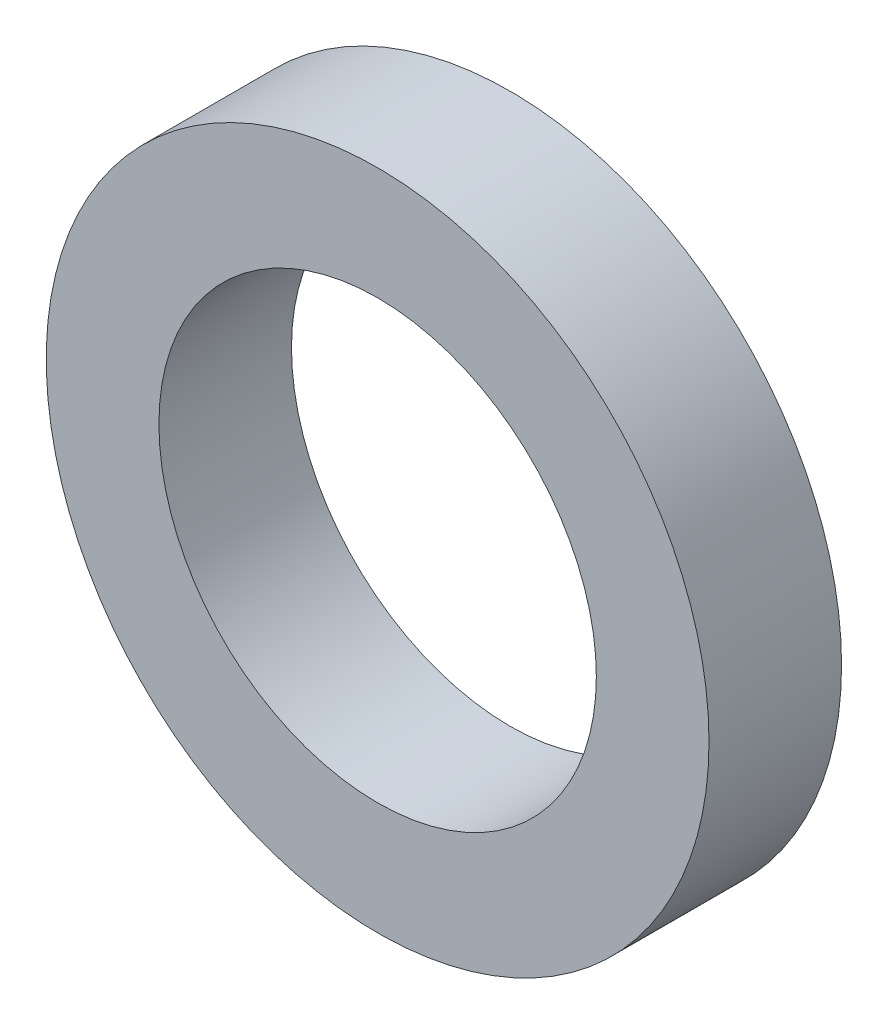
ISO-10303-21;
HEADER;
FILE_DESCRIPTION(('STEP AP214'),'2;1');
FILE_NAME('part.step','',(''),(''),'','','');
FILE_SCHEMA(('AUTOMOTIVE_DESIGN { 1 0 10303 214 1 1 1 1 }'));
ENDSEC;
DATA;
#1=APPLICATION_CONTEXT('core data for automotive mechanical design processes');
#2=APPLICATION_PROTOCOL_DEFINITION('international standard','automotive_design',2000,#1);
#3=PRODUCT_CONTEXT('',#1,'mechanical');
#4=PRODUCT('Part','Part','',(#3));
#5=PRODUCT_RELATED_PRODUCT_CATEGORY('part','',(#4));
#6=PRODUCT_DEFINITION_FORMATION('','',#4);
#7=PRODUCT_DEFINITION_CONTEXT('part definition',#1,'design');
#8=PRODUCT_DEFINITION('design','',#6,#7);
#9=PRODUCT_DEFINITION_SHAPE('','',#8);
#10=(LENGTH_UNIT() NAMED_UNIT(*) SI_UNIT(.MILLI.,.METRE.));
#11=(NAMED_UNIT(*) PLANE_ANGLE_UNIT() SI_UNIT($,.RADIAN.));
#12=(NAMED_UNIT(*) SI_UNIT($,.STERADIAN.) SOLID_ANGLE_UNIT());
#13=UNCERTAINTY_MEASURE_WITH_UNIT(LENGTH_MEASURE(1.E-05),#10,'distance_accuracy_value','');
#14=(GEOMETRIC_REPRESENTATION_CONTEXT(3) GLOBAL_UNCERTAINTY_ASSIGNED_CONTEXT((#13)) GLOBAL_UNIT_ASSIGNED_CONTEXT((#10,
#11,#12)) REPRESENTATION_CONTEXT('',''));
#15=CARTESIAN_POINT('',(0.,0.,0.));
#16=DIRECTION('',(0.,0.,1.));
#17=DIRECTION('',(1.,0.,0.));
#18=AXIS2_PLACEMENT_3D('',#15,#16,#17);
#19=CARTESIAN_POINT('',(0.,0.,2.53999999999999));
#20=DIRECTION('',(0.,0.,1.));
#21=DIRECTION('',(1.,0.,0.));
#22=AXIS2_PLACEMENT_3D('',#19,#20,#21);
#23=PLANE('',#22);
#24=CARTESIAN_POINT('',(0.,0.,2.53999999999999));
#25=DIRECTION('',(0.,0.,1.));
#26=DIRECTION('',(1.,0.,0.));
#27=AXIS2_PLACEMENT_3D('',#24,#25,#26);
#28=CIRCLE('',#27,6.35);
#29=CARTESIAN_POINT('',(6.35,0.,2.53999999999999));
#30=VERTEX_POINT('',#29);
#31=EDGE_CURVE('E12',#30,#30,#28,.T.);
#32=ORIENTED_EDGE('',*,*,#31,.T.);
#33=EDGE_LOOP('',(#32));
#34=FACE_BOUND('',#33,.T.);
#35=CARTESIAN_POINT('',(0.,0.,2.53999999999999));
#36=DIRECTION('',(0.,0.,1.));
#37=DIRECTION('',(1.,0.,0.));
#38=AXIS2_PLACEMENT_3D('',#35,#36,#37);
#39=CIRCLE('',#38,4.191);
#40=CARTESIAN_POINT('',(4.191,0.,2.53999999999999));
#41=VERTEX_POINT('',#40);
#42=EDGE_CURVE('E51',#41,#41,#39,.T.);
#43=ORIENTED_EDGE('',*,*,#42,.F.);
#44=EDGE_LOOP('',(#43));
#45=FACE_BOUND('',#44,.T.);
#46=ADVANCED_FACE('F40',(#34,#45),#23,.T.);
#47=CARTESIAN_POINT('',(0.,0.,0.));
#48=DIRECTION('',(0.,0.,1.));
#49=DIRECTION('',(1.,0.,0.));
#50=AXIS2_PLACEMENT_3D('',#47,#48,#49);
#51=PLANE('',#50);
#52=CARTESIAN_POINT('',(0.,0.,0.));
#53=DIRECTION('',(0.,0.,1.));
#54=DIRECTION('',(1.,0.,0.));
#55=AXIS2_PLACEMENT_3D('',#52,#53,#54);
#56=CIRCLE('',#55,6.35);
#57=CARTESIAN_POINT('',(6.35,0.,0.));
#58=VERTEX_POINT('',#57);
#59=EDGE_CURVE('E44',#58,#58,#56,.T.);
#60=ORIENTED_EDGE('',*,*,#59,.F.);
#61=EDGE_LOOP('',(#60));
#62=FACE_BOUND('',#61,.T.);
#63=CARTESIAN_POINT('',(0.,0.,0.));
#64=DIRECTION('',(0.,0.,1.));
#65=DIRECTION('',(1.,0.,0.));
#66=AXIS2_PLACEMENT_3D('',#63,#64,#65);
#67=CIRCLE('',#66,4.191);
#68=CARTESIAN_POINT('',(4.191,0.,0.));
#69=VERTEX_POINT('',#68);
#70=EDGE_CURVE('E53',#69,#69,#67,.T.);
#71=ORIENTED_EDGE('',*,*,#70,.T.);
#72=EDGE_LOOP('',(#71));
#73=FACE_BOUND('',#72,.T.);
#74=ADVANCED_FACE('F63',(#62,#73),#51,.F.);
#75=CARTESIAN_POINT('',(0.,0.,2.53999999999999));
#76=DIRECTION('',(0.,0.,-1.));
#77=DIRECTION('',(-1.,0.,0.));
#78=AXIS2_PLACEMENT_3D('',#75,#76,#77);
#79=CYLINDRICAL_SURFACE('',#78,6.35);
#80=ORIENTED_EDGE('',*,*,#31,.F.);
#81=EDGE_LOOP('',(#80));
#82=FACE_BOUND('',#81,.T.);
#83=ORIENTED_EDGE('',*,*,#59,.T.);
#84=EDGE_LOOP('',(#83));
#85=FACE_BOUND('',#84,.T.);
#86=ADVANCED_FACE('F42',(#82,#85),#79,.T.);
#87=CARTESIAN_POINT('',(0.,0.,2.53999999999999));
#88=DIRECTION('',(0.,0.,-1.));
#89=DIRECTION('',(-1.,0.,0.));
#90=AXIS2_PLACEMENT_3D('',#87,#88,#89);
#91=CYLINDRICAL_SURFACE('',#90,4.191);
#92=ORIENTED_EDGE('',*,*,#42,.T.);
#93=EDGE_LOOP('',(#92));
#94=FACE_BOUND('',#93,.T.);
#95=ORIENTED_EDGE('',*,*,#70,.F.);
#96=EDGE_LOOP('',(#95));
#97=FACE_BOUND('',#96,.T.);
#98=ADVANCED_FACE('F59',(#94,#97),#91,.F.);
#99=CLOSED_SHELL('',(#46,#74,#86,#98));
#100=MANIFOLD_SOLID_BREP('B2',#99);
#101=ADVANCED_BREP_SHAPE_REPRESENTATION('',(#18,#100),#14);
#102=SHAPE_DEFINITION_REPRESENTATION(#9,#101);
ENDSEC;
END-ISO-10303-21;
